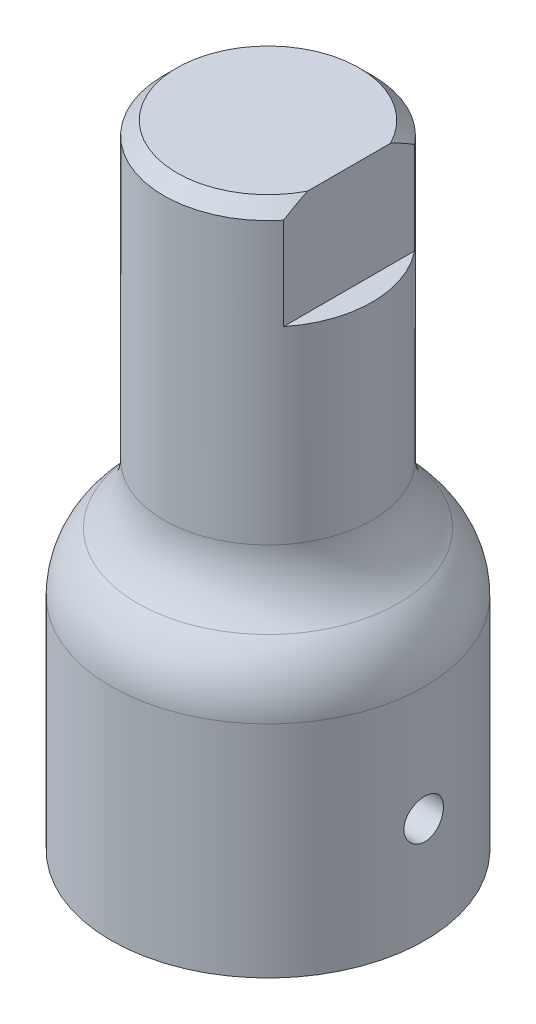
ISO-10303-21;
HEADER;
FILE_DESCRIPTION(('STEP AP214'),'2;1');
FILE_NAME('part.step','',(''),(''),'','','');
FILE_SCHEMA(('AUTOMOTIVE_DESIGN { 1 0 10303 214 1 1 1 1 }'));
ENDSEC;
DATA;
#1=APPLICATION_CONTEXT('core data for automotive mechanical design processes');
#2=APPLICATION_PROTOCOL_DEFINITION('international standard','automotive_design',2000,#1);
#3=PRODUCT_CONTEXT('',#1,'mechanical');
#4=PRODUCT('Part','Part','',(#3));
#5=PRODUCT_RELATED_PRODUCT_CATEGORY('part','',(#4));
#6=PRODUCT_DEFINITION_FORMATION('','',#4);
#7=PRODUCT_DEFINITION_CONTEXT('part definition',#1,'design');
#8=PRODUCT_DEFINITION('design','',#6,#7);
#9=PRODUCT_DEFINITION_SHAPE('','',#8);
#10=(LENGTH_UNIT() NAMED_UNIT(*) SI_UNIT(.MILLI.,.METRE.));
#11=(NAMED_UNIT(*) PLANE_ANGLE_UNIT() SI_UNIT($,.RADIAN.));
#12=(NAMED_UNIT(*) SI_UNIT($,.STERADIAN.) SOLID_ANGLE_UNIT());
#13=UNCERTAINTY_MEASURE_WITH_UNIT(LENGTH_MEASURE(1.E-05),#10,'distance_accuracy_value','');
#14=(GEOMETRIC_REPRESENTATION_CONTEXT(3) GLOBAL_UNCERTAINTY_ASSIGNED_CONTEXT((#13)) GLOBAL_UNIT_ASSIGNED_CONTEXT((#10,
#11,#12)) REPRESENTATION_CONTEXT('',''));
#15=CARTESIAN_POINT('',(0.,0.,0.));
#16=DIRECTION('',(0.,0.,1.));
#17=DIRECTION('',(1.,0.,0.));
#18=AXIS2_PLACEMENT_3D('',#15,#16,#17);
#19=CARTESIAN_POINT('',(0.,38.1,0.));
#20=DIRECTION('',(0.,-1.,0.));
#21=DIRECTION('',(0.,0.,-1.));
#22=AXIS2_PLACEMENT_3D('',#19,#20,#21);
#23=CYLINDRICAL_SURFACE('',#22,6.2865);
#24=CARTESIAN_POINT('',(0.,20.3651280605346,0.));
#25=DIRECTION('',(0.,-1.,0.));
#26=DIRECTION('',(0.,0.,-1.));
#27=AXIS2_PLACEMENT_3D('',#24,#25,#26);
#28=CIRCLE('',#27,6.2865);
#29=CARTESIAN_POINT('',(0.,20.3651280605346,-6.2865));
#30=VERTEX_POINT('',#29);
#31=EDGE_CURVE('E166',#30,#30,#28,.F.);
#32=ORIENTED_EDGE('',*,*,#31,.T.);
#33=EDGE_LOOP('',(#32));
#34=FACE_BOUND('',#33,.T.);
#35=DIRECTION('',(0.,1.,0.));
#36=VECTOR('',#35,1.);
#37=CARTESIAN_POINT('',(4.8895,31.75,3.95131269327043));
#38=LINE('',#37,#36);
#39=CARTESIAN_POINT('',(4.8895,31.75,3.95131269327043));
#40=VERTEX_POINT('',#39);
#41=CARTESIAN_POINT('',(4.8895,37.30625,3.95131269327043));
#42=VERTEX_POINT('',#41);
#43=EDGE_CURVE('E87',#40,#42,#38,.T.);
#44=ORIENTED_EDGE('',*,*,#43,.T.);
#45=CARTESIAN_POINT('',(0.,37.30625,0.));
#46=DIRECTION('',(0.,1.,0.));
#47=DIRECTION('',(0.,0.,1.));
#48=AXIS2_PLACEMENT_3D('',#45,#46,#47);
#49=CIRCLE('',#48,6.2865);
#50=CARTESIAN_POINT('',(4.8895,37.30625,-3.95131269327043));
#51=VERTEX_POINT('',#50);
#52=EDGE_CURVE('E11',#42,#51,#49,.F.);
#53=ORIENTED_EDGE('',*,*,#52,.T.);
#54=DIRECTION('',(0.,1.,0.));
#55=VECTOR('',#54,1.);
#56=CARTESIAN_POINT('',(4.8895,31.75,-3.95131269327043));
#57=LINE('',#56,#55);
#58=CARTESIAN_POINT('',(4.8895,31.75,-3.95131269327043));
#59=VERTEX_POINT('',#58);
#60=EDGE_CURVE('E85',#59,#51,#57,.T.);
#61=ORIENTED_EDGE('',*,*,#60,.F.);
#62=CARTESIAN_POINT('',(0.,31.75,0.));
#63=DIRECTION('',(0.,1.,0.));
#64=DIRECTION('',(0.,0.,1.));
#65=AXIS2_PLACEMENT_3D('',#62,#63,#64);
#66=CIRCLE('',#65,6.2865);
#67=EDGE_CURVE('E90',#40,#59,#66,.T.);
#68=ORIENTED_EDGE('',*,*,#67,.F.);
#69=EDGE_LOOP('',(#44,#53,#61,#68));
#70=FACE_BOUND('',#69,.T.);
#71=ADVANCED_FACE('F38',(#34,#70),#23,.T.);
#72=CARTESIAN_POINT('',(0.,38.1,0.));
#73=DIRECTION('',(0.,1.,0.));
#74=DIRECTION('',(0.,0.,1.));
#75=AXIS2_PLACEMENT_3D('',#72,#73,#74);
#76=PLANE('',#75);
#77=DIRECTION('',(0.,0.,-1.));
#78=VECTOR('',#77,1.);
#79=CARTESIAN_POINT('',(4.8895,38.1,3.95131269327043));
#80=LINE('',#79,#78);
#81=CARTESIAN_POINT('',(4.8895,38.1,2.50261709266517));
#82=VERTEX_POINT('',#81);
#83=CARTESIAN_POINT('',(4.8895,38.1,-2.50261709266517));
#84=VERTEX_POINT('',#83);
#85=EDGE_CURVE('E93',#82,#84,#80,.T.);
#86=ORIENTED_EDGE('',*,*,#85,.T.);
#87=CARTESIAN_POINT('',(0.,38.1,0.));
#88=DIRECTION('',(0.,1.,0.));
#89=DIRECTION('',(0.,0.,1.));
#90=AXIS2_PLACEMENT_3D('',#87,#88,#89);
#91=CIRCLE('',#90,5.49274999999999);
#92=EDGE_CURVE('E169',#84,#82,#91,.T.);
#93=ORIENTED_EDGE('',*,*,#92,.T.);
#94=EDGE_LOOP('',(#86,#93));
#95=FACE_BOUND('',#94,.T.);
#96=ADVANCED_FACE('F143',(#95),#76,.T.);
#97=CARTESIAN_POINT('',(0.,0.,0.));
#98=DIRECTION('',(0.,1.,0.));
#99=DIRECTION('',(0.,0.,1.));
#100=AXIS2_PLACEMENT_3D('',#97,#98,#99);
#101=PLANE('',#100);
#102=CARTESIAN_POINT('',(0.,0.,0.));
#103=DIRECTION('',(0.,1.,0.));
#104=DIRECTION('',(0.,0.,1.));
#105=AXIS2_PLACEMENT_3D('',#102,#103,#104);
#106=CIRCLE('',#105,9.4615);
#107=CARTESIAN_POINT('',(0.,0.,9.4615));
#108=VERTEX_POINT('',#107);
#109=EDGE_CURVE('E171',#108,#108,#106,.T.);
#110=ORIENTED_EDGE('',*,*,#109,.F.);
#111=EDGE_LOOP('',(#110));
#112=FACE_BOUND('',#111,.T.);
#113=CARTESIAN_POINT('',(0.,0.,0.));
#114=DIRECTION('',(0.,1.,0.));
#115=DIRECTION('',(0.,0.,1.));
#116=AXIS2_PLACEMENT_3D('',#113,#114,#115);
#117=CIRCLE('',#116,6.477);
#118=CARTESIAN_POINT('',(4.8895,0.,-4.24786049088244));
#119=VERTEX_POINT('',#118);
#120=CARTESIAN_POINT('',(4.8895,0.,4.24786049088244));
#121=VERTEX_POINT('',#120);
#122=EDGE_CURVE('E110',#119,#121,#117,.T.);
#123=ORIENTED_EDGE('',*,*,#122,.T.);
#124=DIRECTION('',(0.,0.,-1.));
#125=VECTOR('',#124,1.);
#126=CARTESIAN_POINT('',(4.8895,0.,4.24786049088244));
#127=LINE('',#126,#125);
#128=EDGE_CURVE('E241',#121,#119,#127,.T.);
#129=ORIENTED_EDGE('',*,*,#128,.T.);
#130=EDGE_LOOP('',(#123,#129));
#131=FACE_BOUND('',#130,.T.);
#132=ADVANCED_FACE('F140',(#112,#131),#101,.F.);
#133=CARTESIAN_POINT('',(0.,15.875,0.));
#134=DIRECTION('',(0.,-1.,0.));
#135=DIRECTION('',(0.,0.,-1.));
#136=AXIS2_PLACEMENT_3D('',#133,#134,#135);
#137=CYLINDRICAL_SURFACE('',#136,9.4615);
#138=CARTESIAN_POINT('',(9.4615,5.159375,0.));
#139=CARTESIAN_POINT('',(9.46149906578877,5.15937782694142,0.0665955923247563));
#140=CARTESIAN_POINT('',(9.46078946782667,5.16498120665974,0.133232707915061));
#141=CARTESIAN_POINT('',(9.45802699792556,5.18724558952168,0.264652401247792));
#142=CARTESIAN_POINT('',(9.4559727263353,5.20391811463623,0.329432973124758));
#143=CARTESIAN_POINT('',(9.45075231645352,5.24782157800281,0.455218004663156));
#144=CARTESIAN_POINT('',(9.44758692953626,5.27504538241046,0.516224983447316));
#145=CARTESIAN_POINT('',(9.44049627423047,5.33926296341818,0.632792808415883));
#146=CARTESIAN_POINT('',(9.43657113545646,5.37625507392569,0.688354581126615));
#147=CARTESIAN_POINT('',(9.42837468755259,5.4591797056671,0.792776138359194));
#148=CARTESIAN_POINT('',(9.42410175245587,5.50515581551811,0.841601183591291));
#149=CARTESIAN_POINT('',(9.41570439674951,5.60464976321746,0.930864123574371));
#150=CARTESIAN_POINT('',(9.41157998374697,5.65816798667429,0.971301589228939));
#151=CARTESIAN_POINT('',(9.40393064960859,5.77145295266594,1.04277106448273));
#152=CARTESIAN_POINT('',(9.40040782302818,5.83124040216769,1.07377049533973));
#153=CARTESIAN_POINT('',(9.3943819882871,5.95522437218779,1.12527587844151));
#154=CARTESIAN_POINT('',(9.39187894094402,6.01942072319453,1.14578223386377));
#155=CARTESIAN_POINT('',(9.38819160562376,6.15003951190106,1.17561373565146));
#156=CARTESIAN_POINT('',(9.38700039891481,6.21644834892568,1.18499756315806));
#157=CARTESIAN_POINT('',(9.38605044652213,6.34990810239078,1.19249922220742));
#158=CARTESIAN_POINT('',(9.3862916424835,6.41695899256344,1.19061751269878));
#159=CARTESIAN_POINT('',(9.38817291201105,6.54939039165244,1.17568967645467));
#160=CARTESIAN_POINT('',(9.3898048833839,6.61477832081451,1.16270821173111));
#161=CARTESIAN_POINT('',(9.394271182951,6.74244022848938,1.12605025979061));
#162=CARTESIAN_POINT('',(9.39710553580586,6.80471414310507,1.10237355321572));
#163=CARTESIAN_POINT('',(9.40366641559032,6.92458104462984,1.0449277797332));
#164=CARTESIAN_POINT('',(9.40739541878263,6.98216043443739,1.01113063533419));
#165=CARTESIAN_POINT('',(9.41532352183911,7.09085481570547,0.934423446518939));
#166=CARTESIAN_POINT('',(9.41952264348924,7.1419695073488,0.891512979695758));
#167=CARTESIAN_POINT('',(9.42795385525478,7.23665883506219,0.797438962837913));
#168=CARTESIAN_POINT('',(9.43218597018336,7.28017811934494,0.746219681941315));
#169=CARTESIAN_POINT('',(9.44017878609475,7.35801022410089,0.637173793477446));
#170=CARTESIAN_POINT('',(9.44393948596542,7.39232302285506,0.579347170323247));
#171=CARTESIAN_POINT('',(9.45056812141535,7.45076827028881,0.458685233833948));
#172=CARTESIAN_POINT('',(9.45343575079842,7.47489722836414,0.395848211898781));
#173=CARTESIAN_POINT('',(9.45795236933385,7.51224579118798,0.266970293169451));
#174=CARTESIAN_POINT('',(9.45960141631083,7.52546591358998,0.200929548557988));
#175=CARTESIAN_POINT('',(9.46148754558157,7.54054973669,0.0679974107655114));
#176=CARTESIAN_POINT('',(9.46173410734242,7.5424896826492,0.00111479835103478));
#177=CARTESIAN_POINT('',(9.46081308588319,7.53515933315302,-0.132022094410299));
#178=CARTESIAN_POINT('',(9.45964553319375,7.52588927972088,-0.198276388291393));
#179=CARTESIAN_POINT('',(9.45603338012747,7.49646541607601,-0.328050768944093));
#180=CARTESIAN_POINT('',(9.45359304917654,7.47634798487956,-0.391579232915874));
#181=CARTESIAN_POINT('',(9.44770853871787,7.4258382647186,-0.514360767640468));
#182=CARTESIAN_POINT('',(9.44426432470781,7.39544562260121,-0.573613691360558));
#183=CARTESIAN_POINT('',(9.43673237182855,7.32506391810072,-0.686502525005907));
#184=CARTESIAN_POINT('',(9.43264136593917,7.28502556505349,-0.740107482434251));
#185=CARTESIAN_POINT('',(9.42428361830394,7.19655867974053,-0.839863764528427));
#186=CARTESIAN_POINT('',(9.42001686949018,7.14812980977955,-0.886014789049421));
#187=CARTESIAN_POINT('',(9.41175925397741,7.04392064311545,-0.969823876583035));
#188=CARTESIAN_POINT('',(9.40777012181949,6.98809952746204,-1.00743138069409));
#189=CARTESIAN_POINT('',(9.40054799614114,6.87088838625857,-1.07273654001839));
#190=CARTESIAN_POINT('',(9.39731498729147,6.80949847364238,-1.10043439614064));
#191=CARTESIAN_POINT('',(9.39198299312714,6.6830551255491,-1.14505227442555));
#192=CARTESIAN_POINT('',(9.38988101692357,6.61801185963079,-1.1620007435839));
#193=CARTESIAN_POINT('',(9.38704051798563,6.48597437961496,-1.18473031920196));
#194=CARTESIAN_POINT('',(9.38630193089877,6.41898025775023,-1.19051195274123));
#195=CARTESIAN_POINT('',(9.3862737265623,6.28544580767404,-1.19073397960456));
#196=CARTESIAN_POINT('',(9.38697396098104,6.21890559971965,-1.18525380496281));
#197=CARTESIAN_POINT('',(9.3897226747703,6.08770006120807,-1.1632760450682));
#198=CARTESIAN_POINT('',(9.39177115422474,6.02303473076759,-1.14677845912951));
#199=CARTESIAN_POINT('',(9.39698239403539,5.89742536810433,-1.10325911953931));
#200=CARTESIAN_POINT('',(9.40014474357377,5.83647997360405,-1.07624124559597));
#201=CARTESIAN_POINT('',(9.40722807845511,5.7199750894039,-1.01245608517965));
#202=CARTESIAN_POINT('',(9.41114907380932,5.66441567079292,-0.975688670047477));
#203=CARTESIAN_POINT('',(9.41934102991676,5.55985390036275,-0.893153609705072));
#204=CARTESIAN_POINT('',(9.42361417821985,5.51089843696963,-0.847326775522093));
#205=CARTESIAN_POINT('',(9.43200968256653,5.4213420362932,-0.748097249030615));
#206=CARTESIAN_POINT('',(9.43613200283729,5.38074307054622,-0.694692773949497));
#207=CARTESIAN_POINT('',(9.44377893757703,5.30891871660101,-0.581587724289265));
#208=CARTESIAN_POINT('',(9.44730118802571,5.27773004538194,-0.521863684955646));
#209=CARTESIAN_POINT('',(9.45332718449254,5.22586939486203,-0.398014654424663));
#210=CARTESIAN_POINT('',(9.45583203502016,5.20518600467484,-0.333894524608731));
#211=CARTESIAN_POINT('',(9.45893817341265,5.1798660047843,-0.224536692470697));
#212=CARTESIAN_POINT('',(9.45989417026485,5.17219294320163,-0.179988163888808));
#213=CARTESIAN_POINT('',(9.46117539793985,5.16194650146807,-0.0902994518704707));
#214=CARTESIAN_POINT('',(9.46150063349989,5.15937308301699,-0.0451592728800958));
#215=CARTESIAN_POINT('',(9.4615,5.159375,0.));
#216=B_SPLINE_CURVE_WITH_KNOTS('',3,(#138,#139,#140,#141,#142,#143,#144,#145,#146,#147,#148,
#149,#150,#151,#152,#153,#154,#155,#156,#157,#158,#159,#160,#161,#162,#163,#164,#165,#166,#167,
#168,#169,#170,#171,#172,#173,#174,#175,#176,#177,#178,#179,#180,#181,#182,#183,#184,#185,#186,
#187,#188,#189,#190,#191,#192,#193,#194,#195,#196,#197,#198,#199,#200,#201,#202,#203,#204,#205,
#206,#207,#208,#209,#210,#211,#212,#213,#214,#215),.UNSPECIFIED.,.T.,.F.,(4,2,2,2,2,2,2,2,2,2,2,
2,2,2,2,2,2,2,2,2,2,2,2,2,2,2,2,2,2,2,2,2,2,2,2,2,2,2,4),(0.,0.19962182239255,0.399451759359204,
0.599146823977694,0.798807850370998,0.999462787838104,1.20012798799058,1.40147820111376,
1.60282067713724,1.80309609759855,2.00336335906138,2.20247184374355,2.40158441229899,
2.60125458616584,2.8009340168635,3.0020128186625,3.2030920948225,3.40424023687542,
3.60537883336104,3.80515629374004,4.00492944101226,4.20403673571639,4.40315087431576,
4.60330493593609,4.80346705507982,5.00478450910919,5.20609788138105,5.40687625365724,
5.60764514887407,5.80700283758339,6.00636053870286,6.20564478952492,6.40493167031972,
6.6055663772965,6.80624836560705,7.00770353745833,7.20893941724696,7.34430639485888,
7.47967235581148),.UNSPECIFIED.);
#217=CARTESIAN_POINT('',(9.4615,5.159375,0.));
#218=VERTEX_POINT('',#217);
#219=EDGE_CURVE('E102',#218,#218,#216,.T.);
#220=ORIENTED_EDGE('',*,*,#219,.T.);
#221=EDGE_LOOP('',(#220));
#222=FACE_BOUND('',#221,.T.);
#223=CARTESIAN_POINT('',(0.,13.2656122319727,0.));
#224=DIRECTION('',(0.,-1.,0.));
#225=DIRECTION('',(0.,0.,-1.));
#226=AXIS2_PLACEMENT_3D('',#223,#224,#225);
#227=CIRCLE('',#226,9.4615);
#228=CARTESIAN_POINT('',(0.,13.2656122319727,-9.4615));
#229=VERTEX_POINT('',#228);
#230=EDGE_CURVE('E162',#229,#229,#227,.T.);
#231=ORIENTED_EDGE('',*,*,#230,.T.);
#232=EDGE_LOOP('',(#231));
#233=FACE_BOUND('',#232,.T.);
#234=ORIENTED_EDGE('',*,*,#109,.T.);
#235=EDGE_LOOP('',(#234));
#236=FACE_BOUND('',#235,.T.);
#237=ADVANCED_FACE('F113',(#222,#233,#236),#137,.T.);
#238=CARTESIAN_POINT('',(0.,12.7,0.));
#239=DIRECTION('',(0.,-1.,0.));
#240=DIRECTION('',(0.,0.,-1.));
#241=AXIS2_PLACEMENT_3D('',#238,#239,#240);
#242=CYLINDRICAL_SURFACE('',#241,6.477);
#243=ORIENTED_EDGE('',*,*,#122,.F.);
#244=DIRECTION('',(0.,-1.,0.));
#245=VECTOR('',#244,1.);
#246=CARTESIAN_POINT('',(4.8895,12.7,-4.24786049088244));
#247=LINE('',#246,#245);
#248=CARTESIAN_POINT('',(4.8895,12.7,-4.24786049088244));
#249=VERTEX_POINT('',#248);
#250=EDGE_CURVE('E251',#249,#119,#247,.T.);
#251=ORIENTED_EDGE('',*,*,#250,.F.);
#252=CARTESIAN_POINT('',(0.,12.7,0.));
#253=DIRECTION('',(0.,1.,0.));
#254=DIRECTION('',(0.,0.,1.));
#255=AXIS2_PLACEMENT_3D('',#252,#253,#254);
#256=CIRCLE('',#255,6.477);
#257=CARTESIAN_POINT('',(4.8895,12.7,4.24786049088244));
#258=VERTEX_POINT('',#257);
#259=EDGE_CURVE('E111',#249,#258,#256,.T.);
#260=ORIENTED_EDGE('',*,*,#259,.T.);
#261=DIRECTION('',(0.,-1.,0.));
#262=VECTOR('',#261,1.);
#263=CARTESIAN_POINT('',(4.8895,12.7,4.24786049088244));
#264=LINE('',#263,#262);
#265=EDGE_CURVE('E254',#258,#121,#264,.T.);
#266=ORIENTED_EDGE('',*,*,#265,.T.);
#267=EDGE_LOOP('',(#243,#251,#260,#266));
#268=FACE_BOUND('',#267,.T.);
#269=ADVANCED_FACE('F133',(#268),#242,.F.);
#270=CARTESIAN_POINT('',(4.8895,12.7,4.24786049088244));
#271=DIRECTION('',(-1.,0.,0.));
#272=DIRECTION('',(0.,0.,1.));
#273=AXIS2_PLACEMENT_3D('',#270,#271,#272);
#274=PLANE('',#273);
#275=CARTESIAN_POINT('',(4.8895,6.35,0.));
#276=DIRECTION('',(-1.,0.,0.));
#277=DIRECTION('',(0.,0.,1.));
#278=AXIS2_PLACEMENT_3D('',#275,#276,#277);
#279=CIRCLE('',#278,1.190625);
#280=CARTESIAN_POINT('',(4.8895,6.35,1.190625));
#281=VERTEX_POINT('',#280);
#282=EDGE_CURVE('E96',#281,#281,#279,.T.);
#283=ORIENTED_EDGE('',*,*,#282,.F.);
#284=EDGE_LOOP('',(#283));
#285=FACE_BOUND('',#284,.T.);
#286=ORIENTED_EDGE('',*,*,#128,.F.);
#287=ORIENTED_EDGE('',*,*,#265,.F.);
#288=DIRECTION('',(0.,0.,-1.));
#289=VECTOR('',#288,1.);
#290=CARTESIAN_POINT('',(4.8895,12.7,4.24786049088244));
#291=LINE('',#290,#289);
#292=EDGE_CURVE('E248',#258,#249,#291,.T.);
#293=ORIENTED_EDGE('',*,*,#292,.T.);
#294=ORIENTED_EDGE('',*,*,#250,.T.);
#295=EDGE_LOOP('',(#286,#287,#293,#294));
#296=FACE_BOUND('',#295,.T.);
#297=ADVANCED_FACE('F130',(#285,#296),#274,.T.);
#298=CARTESIAN_POINT('',(0.,12.7,0.));
#299=DIRECTION('',(0.,1.,0.));
#300=DIRECTION('',(0.,0.,1.));
#301=AXIS2_PLACEMENT_3D('',#298,#299,#300);
#302=PLANE('',#301);
#303=ORIENTED_EDGE('',*,*,#259,.F.);
#304=ORIENTED_EDGE('',*,*,#292,.F.);
#305=EDGE_LOOP('',(#303,#304));
#306=FACE_BOUND('',#305,.T.);
#307=ADVANCED_FACE('F126',(#306),#302,.F.);
#308=CARTESIAN_POINT('',(0.,20.3651280605346,0.));
#309=DIRECTION('',(0.,-1.,0.));
#310=DIRECTION('',(0.,0.,-1.));
#311=AXIS2_PLACEMENT_3D('',#308,#309,#310);
#312=TOROIDAL_SURFACE('',#311,11.049,4.7625);
#313=CARTESIAN_POINT('',(0.,16.8153701462537,0.));
#314=DIRECTION('',(0.,1.,0.));
#315=DIRECTION('',(0.,0.,1.));
#316=AXIS2_PLACEMENT_3D('',#313,#314,#315);
#317=CIRCLE('',#316,7.874);
#318=CARTESIAN_POINT('',(0.,16.8153701462537,7.874));
#319=VERTEX_POINT('',#318);
#320=EDGE_CURVE('E165',#319,#319,#317,.T.);
#321=ORIENTED_EDGE('',*,*,#320,.T.);
#322=EDGE_LOOP('',(#321));
#323=FACE_BOUND('',#322,.T.);
#324=ORIENTED_EDGE('',*,*,#31,.F.);
#325=EDGE_LOOP('',(#324));
#326=FACE_BOUND('',#325,.T.);
#327=ADVANCED_FACE('F129',(#323,#326),#312,.F.);
#328=CARTESIAN_POINT('',(0.,13.2656122319727,0.));
#329=DIRECTION('',(0.,-1.,0.));
#330=DIRECTION('',(0.,0.,-1.));
#331=AXIS2_PLACEMENT_3D('',#328,#329,#330);
#332=DEGENERATE_TOROIDAL_SURFACE('',#331,4.699,4.7625,.T.);
#333=ORIENTED_EDGE('',*,*,#230,.F.);
#334=EDGE_LOOP('',(#333));
#335=FACE_BOUND('',#334,.T.);
#336=ORIENTED_EDGE('',*,*,#320,.F.);
#337=EDGE_LOOP('',(#336));
#338=FACE_BOUND('',#337,.T.);
#339=ADVANCED_FACE('F122',(#335,#338),#332,.T.);
#340=CARTESIAN_POINT('',(9.4615,6.35,0.));
#341=DIRECTION('',(-1.,0.,0.));
#342=DIRECTION('',(0.,0.,1.));
#343=AXIS2_PLACEMENT_3D('',#340,#341,#342);
#344=CYLINDRICAL_SURFACE('',#343,1.190625);
#345=ORIENTED_EDGE('',*,*,#282,.T.);
#346=EDGE_LOOP('',(#345));
#347=FACE_BOUND('',#346,.T.);
#348=ORIENTED_EDGE('',*,*,#219,.F.);
#349=EDGE_LOOP('',(#348));
#350=FACE_BOUND('',#349,.T.);
#351=ADVANCED_FACE('F117',(#347,#350),#344,.F.);
#352=CARTESIAN_POINT('',(4.8895,31.75,3.95131269327043));
#353=DIRECTION('',(1.,0.,0.));
#354=DIRECTION('',(0.,0.,-1.));
#355=AXIS2_PLACEMENT_3D('',#352,#353,#354);
#356=PLANE('',#355);
#357=ORIENTED_EDGE('',*,*,#85,.F.);
#358=CARTESIAN_POINT('',(4.8895,38.1,2.50261709266517));
#359=CARTESIAN_POINT('',(4.8895,38.0428169864129,2.62807233363838));
#360=CARTESIAN_POINT('',(4.8895,37.9828658388279,2.75222812932706));
#361=CARTESIAN_POINT('',(4.8895,37.8582936489579,2.9980084333871));
#362=CARTESIAN_POINT('',(4.8895,37.7936778207006,3.11963557811033));
#363=CARTESIAN_POINT('',(4.8895,37.6605287906818,3.36067333211539));
#364=CARTESIAN_POINT('',(4.8895,37.5919965088834,3.48008445327511));
#365=CARTESIAN_POINT('',(4.8895,37.451519404013,3.7170633465092));
#366=CARTESIAN_POINT('',(4.8895,37.3795709081006,3.83462894514068));
#367=CARTESIAN_POINT('',(4.8895,37.30625,3.95131269327043));
#368=B_SPLINE_CURVE_WITH_KNOTS('',3,(#358,#359,#360,#361,#362,#363,#364,#365,#366,#367),
.UNSPECIFIED.,.F.,.F.,(4,2,2,2,4),(0.,0.413535374650093,0.826615464012299,1.23959891780472,
1.6530369027104),.UNSPECIFIED.);
#369=EDGE_CURVE('E47',#82,#42,#368,.T.);
#370=ORIENTED_EDGE('',*,*,#369,.T.);
#371=ORIENTED_EDGE('',*,*,#43,.F.);
#372=DIRECTION('',(0.,0.,-1.));
#373=VECTOR('',#372,1.);
#374=CARTESIAN_POINT('',(4.8895,31.75,3.95131269327043));
#375=LINE('',#374,#373);
#376=EDGE_CURVE('E82',#40,#59,#375,.T.);
#377=ORIENTED_EDGE('',*,*,#376,.T.);
#378=ORIENTED_EDGE('',*,*,#60,.T.);
#379=CARTESIAN_POINT('',(4.8895,37.30625,-3.95131269327043));
#380=CARTESIAN_POINT('',(4.8895,37.3795709081006,-3.83462894514068));
#381=CARTESIAN_POINT('',(4.8895,37.451519404013,-3.7170633465092));
#382=CARTESIAN_POINT('',(4.8895,37.5919965088834,-3.48008445327511));
#383=CARTESIAN_POINT('',(4.8895,37.6605287906818,-3.36067333211539));
#384=CARTESIAN_POINT('',(4.8895,37.7936778207006,-3.11963557811033));
#385=CARTESIAN_POINT('',(4.8895,37.8582936489579,-2.9980084333871));
#386=CARTESIAN_POINT('',(4.8895,37.9828658388279,-2.75222812932706));
#387=CARTESIAN_POINT('',(4.8895,38.0428169864129,-2.62807233363838));
#388=CARTESIAN_POINT('',(4.8895,38.1,-2.50261709266517));
#389=B_SPLINE_CURVE_WITH_KNOTS('',3,(#379,#380,#381,#382,#383,#384,#385,#386,#387,#388),
.UNSPECIFIED.,.F.,.F.,(4,2,2,2,4),(0.,0.41343798490568,0.826421438698102,1.23950152806031,
1.6530369027104),.UNSPECIFIED.);
#390=EDGE_CURVE('E177',#51,#84,#389,.T.);
#391=ORIENTED_EDGE('',*,*,#390,.T.);
#392=EDGE_LOOP('',(#357,#370,#371,#377,#378,#391));
#393=FACE_BOUND('',#392,.T.);
#394=ADVANCED_FACE('F84',(#393),#356,.T.);
#395=CARTESIAN_POINT('',(0.,31.75,0.));
#396=DIRECTION('',(0.,1.,0.));
#397=DIRECTION('',(0.,0.,1.));
#398=AXIS2_PLACEMENT_3D('',#395,#396,#397);
#399=PLANE('',#398);
#400=ORIENTED_EDGE('',*,*,#67,.T.);
#401=ORIENTED_EDGE('',*,*,#376,.F.);
#402=EDGE_LOOP('',(#400,#401));
#403=FACE_BOUND('',#402,.T.);
#404=ADVANCED_FACE('F92',(#403),#399,.T.);
#405=CARTESIAN_POINT('',(0.,38.1,0.));
#406=DIRECTION('',(0.,-1.,0.));
#407=DIRECTION('',(0.,0.,-1.));
#408=AXIS2_PLACEMENT_3D('',#405,#406,#407);
#409=CONICAL_SURFACE('',#408,5.49274999999999,0.785398163397455);
#410=ORIENTED_EDGE('',*,*,#390,.F.);
#411=ORIENTED_EDGE('',*,*,#52,.F.);
#412=ORIENTED_EDGE('',*,*,#369,.F.);
#413=ORIENTED_EDGE('',*,*,#92,.F.);
#414=EDGE_LOOP('',(#410,#411,#412,#413));
#415=FACE_BOUND('',#414,.T.);
#416=ADVANCED_FACE('F40',(#415),#409,.T.);
#417=CLOSED_SHELL('',(#71,#96,#132,#237,#269,#297,#307,#327,#339,#351,#394,#404,#416));
#418=MANIFOLD_SOLID_BREP('B2',#417);
#419=ADVANCED_BREP_SHAPE_REPRESENTATION('',(#18,#418),#14);
#420=SHAPE_DEFINITION_REPRESENTATION(#9,#419);
ENDSEC;
END-ISO-10303-21;
